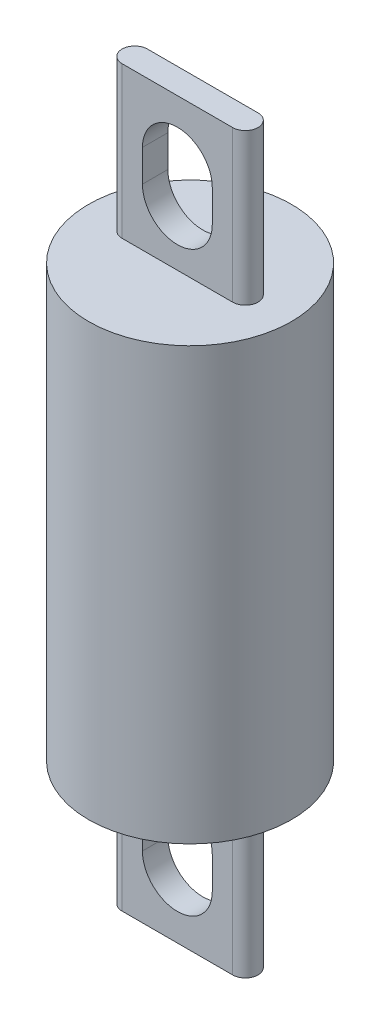
ISO-10303-21;
HEADER;
FILE_DESCRIPTION(('STEP AP214'),'2;1');
FILE_NAME('part.step','',(''),(''),'','','');
FILE_SCHEMA(('AUTOMOTIVE_DESIGN { 1 0 10303 214 1 1 1 1 }'));
ENDSEC;
DATA;
#1=APPLICATION_CONTEXT('core data for automotive mechanical design processes');
#2=APPLICATION_PROTOCOL_DEFINITION('international standard','automotive_design',2000,#1);
#3=PRODUCT_CONTEXT('',#1,'mechanical');
#4=PRODUCT('Part','Part','',(#3));
#5=PRODUCT_RELATED_PRODUCT_CATEGORY('part','',(#4));
#6=PRODUCT_DEFINITION_FORMATION('','',#4);
#7=PRODUCT_DEFINITION_CONTEXT('part definition',#1,'design');
#8=PRODUCT_DEFINITION('design','',#6,#7);
#9=PRODUCT_DEFINITION_SHAPE('','',#8);
#10=(LENGTH_UNIT() NAMED_UNIT(*) SI_UNIT(.MILLI.,.METRE.));
#11=(NAMED_UNIT(*) PLANE_ANGLE_UNIT() SI_UNIT($,.RADIAN.));
#12=(NAMED_UNIT(*) SI_UNIT($,.STERADIAN.) SOLID_ANGLE_UNIT());
#13=UNCERTAINTY_MEASURE_WITH_UNIT(LENGTH_MEASURE(1.E-05),#10,'distance_accuracy_value','');
#14=(GEOMETRIC_REPRESENTATION_CONTEXT(3) GLOBAL_UNCERTAINTY_ASSIGNED_CONTEXT((#13)) GLOBAL_UNIT_ASSIGNED_CONTEXT((#10,
#11,#12)) REPRESENTATION_CONTEXT('',''));
#15=CARTESIAN_POINT('',(0.,0.,0.));
#16=DIRECTION('',(0.,0.,1.));
#17=DIRECTION('',(1.,0.,0.));
#18=AXIS2_PLACEMENT_3D('',#15,#16,#17);
#19=CARTESIAN_POINT('',(4.3688,-38.11905,1.5875));
#20=DIRECTION('',(-1.,0.,0.));
#21=DIRECTION('',(0.,0.,1.));
#22=AXIS2_PLACEMENT_3D('',#19,#20,#21);
#23=PLANE('',#22);
#24=DIRECTION('',(0.,1.,0.));
#25=VECTOR('',#24,1.);
#26=CARTESIAN_POINT('',(4.3688,-26.9875,1.5875));
#27=LINE('',#26,#25);
#28=CARTESIAN_POINT('',(4.3688,-38.11905,1.5875));
#29=VERTEX_POINT('',#28);
#30=CARTESIAN_POINT('',(4.3688,-34.13125,1.5875));
#31=VERTEX_POINT('',#30);
#32=EDGE_CURVE('E136',#29,#31,#27,.T.);
#33=ORIENTED_EDGE('',*,*,#32,.T.);
#34=DIRECTION('',(0.,0.,1.));
#35=VECTOR('',#34,1.);
#36=CARTESIAN_POINT('',(4.3688,-34.13125,1.5875));
#37=LINE('',#36,#35);
#38=CARTESIAN_POINT('',(4.3688,-34.13125,-1.5875));
#39=VERTEX_POINT('',#38);
#40=EDGE_CURVE('E131',#31,#39,#37,.F.);
#41=ORIENTED_EDGE('',*,*,#40,.T.);
#42=DIRECTION('',(0.,1.,0.));
#43=VECTOR('',#42,1.);
#44=CARTESIAN_POINT('',(4.3688,-26.9875,-1.5875));
#45=LINE('',#44,#43);
#46=CARTESIAN_POINT('',(4.3688,-38.11905,-1.5875));
#47=VERTEX_POINT('',#46);
#48=EDGE_CURVE('E133',#39,#47,#45,.F.);
#49=ORIENTED_EDGE('',*,*,#48,.T.);
#50=DIRECTION('',(0.,0.,1.));
#51=VECTOR('',#50,1.);
#52=CARTESIAN_POINT('',(4.3688,-38.11905,1.5875));
#53=LINE('',#52,#51);
#54=EDGE_CURVE('E178',#47,#29,#53,.T.);
#55=ORIENTED_EDGE('',*,*,#54,.T.);
#56=EDGE_LOOP('',(#33,#41,#49,#55));
#57=FACE_BOUND('',#56,.T.);
#58=ADVANCED_FACE('F16',(#57),#23,.T.);
#59=CARTESIAN_POINT('',(0.,-34.13125,1.5875));
#60=DIRECTION('',(0.,0.,1.));
#61=DIRECTION('',(1.,0.,0.));
#62=AXIS2_PLACEMENT_3D('',#59,#60,#61);
#63=CYLINDRICAL_SURFACE('',#62,4.3688);
#64=ORIENTED_EDGE('',*,*,#40,.F.);
#65=CARTESIAN_POINT('',(0.,-34.13125,1.5875));
#66=DIRECTION('',(0.,0.,1.));
#67=DIRECTION('',(1.,0.,0.));
#68=AXIS2_PLACEMENT_3D('',#65,#66,#67);
#69=CIRCLE('',#68,4.3688);
#70=CARTESIAN_POINT('',(-4.3688,-34.13125,1.5875));
#71=VERTEX_POINT('',#70);
#72=EDGE_CURVE('E227',#31,#71,#69,.T.);
#73=ORIENTED_EDGE('',*,*,#72,.T.);
#74=DIRECTION('',(0.,0.,1.));
#75=VECTOR('',#74,1.);
#76=CARTESIAN_POINT('',(-4.3688,-34.13125,1.5875));
#77=LINE('',#76,#75);
#78=CARTESIAN_POINT('',(-4.3688,-34.13125,-1.5875));
#79=VERTEX_POINT('',#78);
#80=EDGE_CURVE('E126',#79,#71,#77,.T.);
#81=ORIENTED_EDGE('',*,*,#80,.F.);
#82=CARTESIAN_POINT('',(0.,-34.13125,-1.5875));
#83=DIRECTION('',(0.,0.,1.));
#84=DIRECTION('',(1.,0.,0.));
#85=AXIS2_PLACEMENT_3D('',#82,#83,#84);
#86=CIRCLE('',#85,4.3688);
#87=EDGE_CURVE('E19',#79,#39,#86,.F.);
#88=ORIENTED_EDGE('',*,*,#87,.T.);
#89=EDGE_LOOP('',(#64,#73,#81,#88));
#90=FACE_BOUND('',#89,.T.);
#91=ADVANCED_FACE('F140',(#90),#63,.F.);
#92=CARTESIAN_POINT('',(-4.3688,-34.13125,1.5875));
#93=DIRECTION('',(1.,0.,0.));
#94=DIRECTION('',(0.,1.,0.));
#95=AXIS2_PLACEMENT_3D('',#92,#93,#94);
#96=PLANE('',#95);
#97=DIRECTION('',(0.,1.,0.));
#98=VECTOR('',#97,1.);
#99=CARTESIAN_POINT('',(-4.3688,-26.9875,1.5875));
#100=LINE('',#99,#98);
#101=CARTESIAN_POINT('',(-4.3688,-38.11905,1.5875));
#102=VERTEX_POINT('',#101);
#103=EDGE_CURVE('E226',#71,#102,#100,.F.);
#104=ORIENTED_EDGE('',*,*,#103,.T.);
#105=DIRECTION('',(0.,0.,1.));
#106=VECTOR('',#105,1.);
#107=CARTESIAN_POINT('',(-4.3688,-38.11905,1.5875));
#108=LINE('',#107,#106);
#109=CARTESIAN_POINT('',(-4.3688,-38.11905,-1.5875));
#110=VERTEX_POINT('',#109);
#111=EDGE_CURVE('E167',#102,#110,#108,.F.);
#112=ORIENTED_EDGE('',*,*,#111,.T.);
#113=DIRECTION('',(0.,1.,0.));
#114=VECTOR('',#113,1.);
#115=CARTESIAN_POINT('',(-4.3688,-26.9875,-1.5875));
#116=LINE('',#115,#114);
#117=EDGE_CURVE('E143',#110,#79,#116,.T.);
#118=ORIENTED_EDGE('',*,*,#117,.T.);
#119=ORIENTED_EDGE('',*,*,#80,.T.);
#120=EDGE_LOOP('',(#104,#112,#118,#119));
#121=FACE_BOUND('',#120,.T.);
#122=ADVANCED_FACE('F357',(#121),#96,.T.);
#123=CARTESIAN_POINT('',(0.,-38.11905,1.5875));
#124=DIRECTION('',(0.,0.,1.));
#125=DIRECTION('',(1.,0.,0.));
#126=AXIS2_PLACEMENT_3D('',#123,#124,#125);
#127=CYLINDRICAL_SURFACE('',#126,4.3688);
#128=ORIENTED_EDGE('',*,*,#111,.F.);
#129=CARTESIAN_POINT('',(0.,-38.11905,1.5875));
#130=DIRECTION('',(0.,0.,1.));
#131=DIRECTION('',(1.,0.,0.));
#132=AXIS2_PLACEMENT_3D('',#129,#130,#131);
#133=CIRCLE('',#132,4.3688);
#134=EDGE_CURVE('E223',#102,#29,#133,.T.);
#135=ORIENTED_EDGE('',*,*,#134,.T.);
#136=ORIENTED_EDGE('',*,*,#54,.F.);
#137=CARTESIAN_POINT('',(0.,-38.11905,-1.5875));
#138=DIRECTION('',(0.,0.,1.));
#139=DIRECTION('',(1.,0.,0.));
#140=AXIS2_PLACEMENT_3D('',#137,#138,#139);
#141=CIRCLE('',#140,4.3688);
#142=EDGE_CURVE('E147',#47,#110,#141,.F.);
#143=ORIENTED_EDGE('',*,*,#142,.T.);
#144=EDGE_LOOP('',(#128,#135,#136,#143));
#145=FACE_BOUND('',#144,.T.);
#146=ADVANCED_FACE('F354',(#145),#127,.F.);
#147=CARTESIAN_POINT('',(0.,-45.9105,0.));
#148=DIRECTION('',(0.,1.,0.));
#149=DIRECTION('',(0.,0.,1.));
#150=AXIS2_PLACEMENT_3D('',#147,#148,#149);
#151=PLANE('',#150);
#152=CARTESIAN_POINT('',(-6.9215,-45.9105,0.));
#153=DIRECTION('',(0.,1.,0.));
#154=DIRECTION('',(0.,0.,1.));
#155=AXIS2_PLACEMENT_3D('',#152,#153,#154);
#156=CIRCLE('',#155,1.5875);
#157=CARTESIAN_POINT('',(-6.9215,-45.9105,-1.5875));
#158=VERTEX_POINT('',#157);
#159=CARTESIAN_POINT('',(-6.9215,-45.9105,1.5875));
#160=VERTEX_POINT('',#159);
#161=EDGE_CURVE('E220',#158,#160,#156,.T.);
#162=ORIENTED_EDGE('',*,*,#161,.F.);
#163=DIRECTION('',(1.,0.,0.));
#164=VECTOR('',#163,1.);
#165=CARTESIAN_POINT('',(6.9215,-45.9105,-1.5875));
#166=LINE('',#165,#164);
#167=CARTESIAN_POINT('',(6.9215,-45.9105,-1.5875));
#168=VERTEX_POINT('',#167);
#169=EDGE_CURVE('E149',#158,#168,#166,.T.);
#170=ORIENTED_EDGE('',*,*,#169,.T.);
#171=CARTESIAN_POINT('',(6.9215,-45.9105,0.));
#172=DIRECTION('',(0.,1.,0.));
#173=DIRECTION('',(0.,0.,1.));
#174=AXIS2_PLACEMENT_3D('',#171,#172,#173);
#175=CIRCLE('',#174,1.5875);
#176=CARTESIAN_POINT('',(6.9215,-45.9105,1.5875));
#177=VERTEX_POINT('',#176);
#178=EDGE_CURVE('E177',#177,#168,#175,.T.);
#179=ORIENTED_EDGE('',*,*,#178,.F.);
#180=DIRECTION('',(-1.,0.,0.));
#181=VECTOR('',#180,1.);
#182=CARTESIAN_POINT('',(-6.9215,-45.9105,1.5875));
#183=LINE('',#182,#181);
#184=EDGE_CURVE('E172',#177,#160,#183,.T.);
#185=ORIENTED_EDGE('',*,*,#184,.T.);
#186=EDGE_LOOP('',(#162,#170,#179,#185));
#187=FACE_BOUND('',#186,.T.);
#188=ADVANCED_FACE('F249',(#187),#151,.F.);
#189=CARTESIAN_POINT('',(0.,34.13125,1.5875));
#190=DIRECTION('',(0.,0.,-1.));
#191=DIRECTION('',(-1.,0.,0.));
#192=AXIS2_PLACEMENT_3D('',#189,#190,#191);
#193=CYLINDRICAL_SURFACE('',#192,4.3688);
#194=DIRECTION('',(0.,0.,1.));
#195=VECTOR('',#194,1.);
#196=CARTESIAN_POINT('',(-4.3688,34.13125,1.5875));
#197=LINE('',#196,#195);
#198=CARTESIAN_POINT('',(-4.3688,34.13125,-1.5875));
#199=VERTEX_POINT('',#198);
#200=CARTESIAN_POINT('',(-4.3688,34.13125,1.5875));
#201=VERTEX_POINT('',#200);
#202=EDGE_CURVE('E165',#199,#201,#197,.T.);
#203=ORIENTED_EDGE('',*,*,#202,.T.);
#204=CARTESIAN_POINT('',(0.,34.13125,1.5875));
#205=DIRECTION('',(0.,0.,-1.));
#206=DIRECTION('',(-1.,0.,0.));
#207=AXIS2_PLACEMENT_3D('',#204,#205,#206);
#208=CIRCLE('',#207,4.3688);
#209=CARTESIAN_POINT('',(4.3688,34.13125,1.5875));
#210=VERTEX_POINT('',#209);
#211=EDGE_CURVE('E204',#210,#201,#208,.T.);
#212=ORIENTED_EDGE('',*,*,#211,.F.);
#213=DIRECTION('',(0.,0.,-1.));
#214=VECTOR('',#213,1.);
#215=CARTESIAN_POINT('',(4.3688,34.13125,1.5875));
#216=LINE('',#215,#214);
#217=CARTESIAN_POINT('',(4.3688,34.13125,-1.5875));
#218=VERTEX_POINT('',#217);
#219=EDGE_CURVE('E155',#210,#218,#216,.T.);
#220=ORIENTED_EDGE('',*,*,#219,.T.);
#221=CARTESIAN_POINT('',(0.,34.13125,-1.5875));
#222=DIRECTION('',(0.,0.,-1.));
#223=DIRECTION('',(-1.,0.,0.));
#224=AXIS2_PLACEMENT_3D('',#221,#222,#223);
#225=CIRCLE('',#224,4.3688);
#226=EDGE_CURVE('E214',#199,#218,#225,.F.);
#227=ORIENTED_EDGE('',*,*,#226,.F.);
#228=EDGE_LOOP('',(#203,#212,#220,#227));
#229=FACE_BOUND('',#228,.T.);
#230=ADVANCED_FACE('F347',(#229),#193,.F.);
#231=CARTESIAN_POINT('',(-4.3688,34.13125,1.5875));
#232=DIRECTION('',(-1.,0.,0.));
#233=DIRECTION('',(0.,-1.,0.));
#234=AXIS2_PLACEMENT_3D('',#231,#232,#233);
#235=PLANE('',#234);
#236=DIRECTION('',(0.,0.,-1.));
#237=VECTOR('',#236,1.);
#238=CARTESIAN_POINT('',(-4.3688,38.11905,1.5875));
#239=LINE('',#238,#237);
#240=CARTESIAN_POINT('',(-4.3688,38.11905,-1.5875));
#241=VERTEX_POINT('',#240);
#242=CARTESIAN_POINT('',(-4.3688,38.11905,1.5875));
#243=VERTEX_POINT('',#242);
#244=EDGE_CURVE('E162',#241,#243,#239,.F.);
#245=ORIENTED_EDGE('',*,*,#244,.T.);
#246=DIRECTION('',(0.,1.,0.));
#247=VECTOR('',#246,1.);
#248=CARTESIAN_POINT('',(-4.3688,26.9875,1.5875));
#249=LINE('',#248,#247);
#250=EDGE_CURVE('E203',#201,#243,#249,.T.);
#251=ORIENTED_EDGE('',*,*,#250,.F.);
#252=ORIENTED_EDGE('',*,*,#202,.F.);
#253=DIRECTION('',(0.,1.,0.));
#254=VECTOR('',#253,1.);
#255=CARTESIAN_POINT('',(-4.3688,26.9875,-1.5875));
#256=LINE('',#255,#254);
#257=EDGE_CURVE('E212',#241,#199,#256,.F.);
#258=ORIENTED_EDGE('',*,*,#257,.F.);
#259=EDGE_LOOP('',(#245,#251,#252,#258));
#260=FACE_BOUND('',#259,.T.);
#261=ADVANCED_FACE('F343',(#260),#235,.F.);
#262=CARTESIAN_POINT('',(0.,38.11905,1.5875));
#263=DIRECTION('',(0.,0.,-1.));
#264=DIRECTION('',(-1.,0.,0.));
#265=AXIS2_PLACEMENT_3D('',#262,#263,#264);
#266=CYLINDRICAL_SURFACE('',#265,4.3688);
#267=DIRECTION('',(0.,0.,-1.));
#268=VECTOR('',#267,1.);
#269=CARTESIAN_POINT('',(4.3688,38.11905,1.5875));
#270=LINE('',#269,#268);
#271=CARTESIAN_POINT('',(4.3688,38.11905,-1.5875));
#272=VERTEX_POINT('',#271);
#273=CARTESIAN_POINT('',(4.3688,38.11905,1.5875));
#274=VERTEX_POINT('',#273);
#275=EDGE_CURVE('E160',#272,#274,#270,.F.);
#276=ORIENTED_EDGE('',*,*,#275,.T.);
#277=CARTESIAN_POINT('',(0.,38.11905,1.5875));
#278=DIRECTION('',(0.,0.,-1.));
#279=DIRECTION('',(-1.,0.,0.));
#280=AXIS2_PLACEMENT_3D('',#277,#278,#279);
#281=CIRCLE('',#280,4.3688);
#282=EDGE_CURVE('E199',#243,#274,#281,.T.);
#283=ORIENTED_EDGE('',*,*,#282,.F.);
#284=ORIENTED_EDGE('',*,*,#244,.F.);
#285=CARTESIAN_POINT('',(0.,38.11905,-1.5875));
#286=DIRECTION('',(0.,0.,-1.));
#287=DIRECTION('',(-1.,0.,0.));
#288=AXIS2_PLACEMENT_3D('',#285,#286,#287);
#289=CIRCLE('',#288,4.3688);
#290=EDGE_CURVE('E209',#272,#241,#289,.F.);
#291=ORIENTED_EDGE('',*,*,#290,.F.);
#292=EDGE_LOOP('',(#276,#283,#284,#291));
#293=FACE_BOUND('',#292,.T.);
#294=ADVANCED_FACE('F339',(#293),#266,.F.);
#295=CARTESIAN_POINT('',(4.3688,38.11905,1.5875));
#296=DIRECTION('',(1.,0.,0.));
#297=DIRECTION('',(0.,0.,-1.));
#298=AXIS2_PLACEMENT_3D('',#295,#296,#297);
#299=PLANE('',#298);
#300=ORIENTED_EDGE('',*,*,#219,.F.);
#301=DIRECTION('',(0.,1.,0.));
#302=VECTOR('',#301,1.);
#303=CARTESIAN_POINT('',(4.3688,26.9875,1.5875));
#304=LINE('',#303,#302);
#305=EDGE_CURVE('E202',#274,#210,#304,.F.);
#306=ORIENTED_EDGE('',*,*,#305,.F.);
#307=ORIENTED_EDGE('',*,*,#275,.F.);
#308=DIRECTION('',(0.,1.,0.));
#309=VECTOR('',#308,1.);
#310=CARTESIAN_POINT('',(4.3688,26.9875,-1.5875));
#311=LINE('',#310,#309);
#312=EDGE_CURVE('E213',#218,#272,#311,.T.);
#313=ORIENTED_EDGE('',*,*,#312,.F.);
#314=EDGE_LOOP('',(#300,#306,#307,#313));
#315=FACE_BOUND('',#314,.T.);
#316=ADVANCED_FACE('F336',(#315),#299,.F.);
#317=CARTESIAN_POINT('',(0.,45.9105,0.));
#318=DIRECTION('',(0.,1.,0.));
#319=DIRECTION('',(0.,0.,1.));
#320=AXIS2_PLACEMENT_3D('',#317,#318,#319);
#321=PLANE('',#320);
#322=DIRECTION('',(-1.,0.,0.));
#323=VECTOR('',#322,1.);
#324=CARTESIAN_POINT('',(6.9215,45.9105,-1.5875));
#325=LINE('',#324,#323);
#326=CARTESIAN_POINT('',(-6.9215,45.9105,-1.5875));
#327=VERTEX_POINT('',#326);
#328=CARTESIAN_POINT('',(6.9215,45.9105,-1.5875));
#329=VERTEX_POINT('',#328);
#330=EDGE_CURVE('E168',#327,#329,#325,.F.);
#331=ORIENTED_EDGE('',*,*,#330,.F.);
#332=CARTESIAN_POINT('',(-6.9215,45.9105,0.));
#333=DIRECTION('',(0.,1.,0.));
#334=DIRECTION('',(0.,0.,1.));
#335=AXIS2_PLACEMENT_3D('',#332,#333,#334);
#336=CIRCLE('',#335,1.5875);
#337=CARTESIAN_POINT('',(-6.9215,45.9105,1.5875));
#338=VERTEX_POINT('',#337);
#339=EDGE_CURVE('E217',#338,#327,#336,.F.);
#340=ORIENTED_EDGE('',*,*,#339,.F.);
#341=DIRECTION('',(1.,0.,0.));
#342=VECTOR('',#341,1.);
#343=CARTESIAN_POINT('',(-6.9215,45.9105,1.5875));
#344=LINE('',#343,#342);
#345=CARTESIAN_POINT('',(6.9215,45.9105,1.5875));
#346=VERTEX_POINT('',#345);
#347=EDGE_CURVE('E156',#346,#338,#344,.F.);
#348=ORIENTED_EDGE('',*,*,#347,.F.);
#349=CARTESIAN_POINT('',(6.9215,45.9105,0.));
#350=DIRECTION('',(0.,1.,0.));
#351=DIRECTION('',(0.,0.,1.));
#352=AXIS2_PLACEMENT_3D('',#349,#350,#351);
#353=CIRCLE('',#352,1.5875);
#354=EDGE_CURVE('E207',#329,#346,#353,.F.);
#355=ORIENTED_EDGE('',*,*,#354,.F.);
#356=EDGE_LOOP('',(#331,#340,#348,#355));
#357=FACE_BOUND('',#356,.T.);
#358=ADVANCED_FACE('F312',(#357),#321,.T.);
#359=CARTESIAN_POINT('',(6.9215,-26.9875,-1.5875));
#360=DIRECTION('',(0.,0.,1.));
#361=DIRECTION('',(1.,0.,0.));
#362=AXIS2_PLACEMENT_3D('',#359,#360,#361);
#363=PLANE('',#362);
#364=DIRECTION('',(0.,1.,0.));
#365=VECTOR('',#364,1.);
#366=CARTESIAN_POINT('',(6.9215,-26.9875,-1.5875));
#367=LINE('',#366,#365);
#368=CARTESIAN_POINT('',(6.9215,-26.9875,-1.5875));
#369=VERTEX_POINT('',#368);
#370=EDGE_CURVE('E152',#168,#369,#367,.T.);
#371=ORIENTED_EDGE('',*,*,#370,.F.);
#372=ORIENTED_EDGE('',*,*,#169,.F.);
#373=DIRECTION('',(0.,1.,0.));
#374=VECTOR('',#373,1.);
#375=CARTESIAN_POINT('',(-6.9215,-26.9875,-1.5875));
#376=LINE('',#375,#374);
#377=CARTESIAN_POINT('',(-6.9215,-26.9875,-1.5875));
#378=VERTEX_POINT('',#377);
#379=EDGE_CURVE('E174',#378,#158,#376,.F.);
#380=ORIENTED_EDGE('',*,*,#379,.F.);
#381=DIRECTION('',(1.,0.,0.));
#382=VECTOR('',#381,1.);
#383=CARTESIAN_POINT('',(0.,-26.9875,-1.5875));
#384=LINE('',#383,#382);
#385=EDGE_CURVE('E198',#378,#369,#384,.T.);
#386=ORIENTED_EDGE('',*,*,#385,.T.);
#387=EDGE_LOOP('',(#371,#372,#380,#386));
#388=FACE_BOUND('',#387,.T.);
#389=ORIENTED_EDGE('',*,*,#48,.F.);
#390=ORIENTED_EDGE('',*,*,#87,.F.);
#391=ORIENTED_EDGE('',*,*,#117,.F.);
#392=ORIENTED_EDGE('',*,*,#142,.F.);
#393=EDGE_LOOP('',(#389,#390,#391,#392));
#394=FACE_BOUND('',#393,.T.);
#395=ADVANCED_FACE('F145',(#388,#394),#363,.F.);
#396=CARTESIAN_POINT('',(6.9215,-26.9875,0.));
#397=DIRECTION('',(0.,1.,0.));
#398=DIRECTION('',(0.,0.,1.));
#399=AXIS2_PLACEMENT_3D('',#396,#397,#398);
#400=CYLINDRICAL_SURFACE('',#399,1.5875);
#401=ORIENTED_EDGE('',*,*,#178,.T.);
#402=ORIENTED_EDGE('',*,*,#370,.T.);
#403=CARTESIAN_POINT('',(6.9215,-26.9875,0.));
#404=DIRECTION('',(0.,1.,0.));
#405=DIRECTION('',(0.,0.,1.));
#406=AXIS2_PLACEMENT_3D('',#403,#404,#405);
#407=CIRCLE('',#406,1.5875);
#408=CARTESIAN_POINT('',(6.9215,-26.9875,1.5875));
#409=VERTEX_POINT('',#408);
#410=EDGE_CURVE('E196',#369,#409,#407,.F.);
#411=ORIENTED_EDGE('',*,*,#410,.T.);
#412=DIRECTION('',(0.,1.,0.));
#413=VECTOR('',#412,1.);
#414=CARTESIAN_POINT('',(6.9215,-26.9875,1.5875));
#415=LINE('',#414,#413);
#416=EDGE_CURVE('E175',#409,#177,#415,.F.);
#417=ORIENTED_EDGE('',*,*,#416,.T.);
#418=EDGE_LOOP('',(#401,#402,#411,#417));
#419=FACE_BOUND('',#418,.T.);
#420=ADVANCED_FACE('F240',(#419),#400,.T.);
#421=CARTESIAN_POINT('',(-6.9215,-26.9875,1.5875));
#422=DIRECTION('',(0.,0.,-1.));
#423=DIRECTION('',(-1.,0.,0.));
#424=AXIS2_PLACEMENT_3D('',#421,#422,#423);
#425=PLANE('',#424);
#426=DIRECTION('',(0.,1.,0.));
#427=VECTOR('',#426,1.);
#428=CARTESIAN_POINT('',(-6.9215,-26.9875,1.5875));
#429=LINE('',#428,#427);
#430=CARTESIAN_POINT('',(-6.9215,-26.9875,1.5875));
#431=VERTEX_POINT('',#430);
#432=EDGE_CURVE('E219',#160,#431,#429,.T.);
#433=ORIENTED_EDGE('',*,*,#432,.F.);
#434=ORIENTED_EDGE('',*,*,#184,.F.);
#435=ORIENTED_EDGE('',*,*,#416,.F.);
#436=DIRECTION('',(1.,0.,0.));
#437=VECTOR('',#436,1.);
#438=CARTESIAN_POINT('',(0.,-26.9875,1.5875));
#439=LINE('',#438,#437);
#440=EDGE_CURVE('E195',#409,#431,#439,.F.);
#441=ORIENTED_EDGE('',*,*,#440,.T.);
#442=EDGE_LOOP('',(#433,#434,#435,#441));
#443=FACE_BOUND('',#442,.T.);
#444=ORIENTED_EDGE('',*,*,#103,.F.);
#445=ORIENTED_EDGE('',*,*,#72,.F.);
#446=ORIENTED_EDGE('',*,*,#32,.F.);
#447=ORIENTED_EDGE('',*,*,#134,.F.);
#448=EDGE_LOOP('',(#444,#445,#446,#447));
#449=FACE_BOUND('',#448,.T.);
#450=ADVANCED_FACE('F244',(#443,#449),#425,.F.);
#451=CARTESIAN_POINT('',(-6.9215,-26.9875,0.));
#452=DIRECTION('',(0.,1.,0.));
#453=DIRECTION('',(0.,0.,1.));
#454=AXIS2_PLACEMENT_3D('',#451,#452,#453);
#455=CYLINDRICAL_SURFACE('',#454,1.5875);
#456=ORIENTED_EDGE('',*,*,#161,.T.);
#457=ORIENTED_EDGE('',*,*,#432,.T.);
#458=CARTESIAN_POINT('',(-6.9215,-26.9875,0.));
#459=DIRECTION('',(0.,1.,0.));
#460=DIRECTION('',(0.,0.,1.));
#461=AXIS2_PLACEMENT_3D('',#458,#459,#460);
#462=CIRCLE('',#461,1.5875);
#463=EDGE_CURVE('E192',#431,#378,#462,.F.);
#464=ORIENTED_EDGE('',*,*,#463,.T.);
#465=ORIENTED_EDGE('',*,*,#379,.T.);
#466=EDGE_LOOP('',(#456,#457,#464,#465));
#467=FACE_BOUND('',#466,.T.);
#468=ADVANCED_FACE('F275',(#467),#455,.T.);
#469=CARTESIAN_POINT('',(-6.9215,26.9875,0.));
#470=DIRECTION('',(0.,1.,0.));
#471=DIRECTION('',(0.,0.,1.));
#472=AXIS2_PLACEMENT_3D('',#469,#470,#471);
#473=CYLINDRICAL_SURFACE('',#472,1.5875);
#474=ORIENTED_EDGE('',*,*,#339,.T.);
#475=DIRECTION('',(0.,1.,0.));
#476=VECTOR('',#475,1.);
#477=CARTESIAN_POINT('',(-6.9215,26.9875,-1.5875));
#478=LINE('',#477,#476);
#479=CARTESIAN_POINT('',(-6.9215,26.9875,-1.5875));
#480=VERTEX_POINT('',#479);
#481=EDGE_CURVE('E171',#480,#327,#478,.T.);
#482=ORIENTED_EDGE('',*,*,#481,.F.);
#483=CARTESIAN_POINT('',(-6.9215,26.9875,0.));
#484=DIRECTION('',(0.,1.,0.));
#485=DIRECTION('',(0.,0.,1.));
#486=AXIS2_PLACEMENT_3D('',#483,#484,#485);
#487=CIRCLE('',#486,1.5875);
#488=CARTESIAN_POINT('',(-6.9215,26.9875,1.5875));
#489=VERTEX_POINT('',#488);
#490=EDGE_CURVE('E189',#489,#480,#487,.F.);
#491=ORIENTED_EDGE('',*,*,#490,.F.);
#492=DIRECTION('',(0.,1.,0.));
#493=VECTOR('',#492,1.);
#494=CARTESIAN_POINT('',(-6.9215,26.9875,1.5875));
#495=LINE('',#494,#493);
#496=EDGE_CURVE('E159',#338,#489,#495,.F.);
#497=ORIENTED_EDGE('',*,*,#496,.F.);
#498=EDGE_LOOP('',(#474,#482,#491,#497));
#499=FACE_BOUND('',#498,.T.);
#500=ADVANCED_FACE('F317',(#499),#473,.T.);
#501=CARTESIAN_POINT('',(6.9215,26.9875,-1.5875));
#502=DIRECTION('',(0.,0.,-1.));
#503=DIRECTION('',(-1.,0.,0.));
#504=AXIS2_PLACEMENT_3D('',#501,#502,#503);
#505=PLANE('',#504);
#506=ORIENTED_EDGE('',*,*,#330,.T.);
#507=DIRECTION('',(0.,1.,0.));
#508=VECTOR('',#507,1.);
#509=CARTESIAN_POINT('',(6.9215,26.9875,-1.5875));
#510=LINE('',#509,#508);
#511=CARTESIAN_POINT('',(6.9215,26.9875,-1.5875));
#512=VERTEX_POINT('',#511);
#513=EDGE_CURVE('E170',#512,#329,#510,.T.);
#514=ORIENTED_EDGE('',*,*,#513,.F.);
#515=DIRECTION('',(1.,0.,0.));
#516=VECTOR('',#515,1.);
#517=CARTESIAN_POINT('',(0.,26.9875,-1.5875));
#518=LINE('',#517,#516);
#519=EDGE_CURVE('E188',#480,#512,#518,.T.);
#520=ORIENTED_EDGE('',*,*,#519,.F.);
#521=ORIENTED_EDGE('',*,*,#481,.T.);
#522=EDGE_LOOP('',(#506,#514,#520,#521));
#523=FACE_BOUND('',#522,.T.);
#524=ORIENTED_EDGE('',*,*,#290,.T.);
#525=ORIENTED_EDGE('',*,*,#257,.T.);
#526=ORIENTED_EDGE('',*,*,#226,.T.);
#527=ORIENTED_EDGE('',*,*,#312,.T.);
#528=EDGE_LOOP('',(#524,#525,#526,#527));
#529=FACE_BOUND('',#528,.T.);
#530=ADVANCED_FACE('F308',(#523,#529),#505,.T.);
#531=CARTESIAN_POINT('',(6.9215,26.9875,0.));
#532=DIRECTION('',(0.,1.,0.));
#533=DIRECTION('',(0.,0.,1.));
#534=AXIS2_PLACEMENT_3D('',#531,#532,#533);
#535=CYLINDRICAL_SURFACE('',#534,1.5875);
#536=ORIENTED_EDGE('',*,*,#354,.T.);
#537=DIRECTION('',(0.,1.,0.));
#538=VECTOR('',#537,1.);
#539=CARTESIAN_POINT('',(6.9215,26.9875,1.5875));
#540=LINE('',#539,#538);
#541=CARTESIAN_POINT('',(6.9215,26.9875,1.5875));
#542=VERTEX_POINT('',#541);
#543=EDGE_CURVE('E34',#542,#346,#540,.T.);
#544=ORIENTED_EDGE('',*,*,#543,.F.);
#545=CARTESIAN_POINT('',(6.9215,26.9875,0.));
#546=DIRECTION('',(0.,1.,0.));
#547=DIRECTION('',(0.,0.,1.));
#548=AXIS2_PLACEMENT_3D('',#545,#546,#547);
#549=CIRCLE('',#548,1.5875);
#550=EDGE_CURVE('E185',#512,#542,#549,.F.);
#551=ORIENTED_EDGE('',*,*,#550,.F.);
#552=ORIENTED_EDGE('',*,*,#513,.T.);
#553=EDGE_LOOP('',(#536,#544,#551,#552));
#554=FACE_BOUND('',#553,.T.);
#555=ADVANCED_FACE('F290',(#554),#535,.T.);
#556=CARTESIAN_POINT('',(-6.9215,26.9875,1.5875));
#557=DIRECTION('',(0.,0.,1.));
#558=DIRECTION('',(1.,0.,0.));
#559=AXIS2_PLACEMENT_3D('',#556,#557,#558);
#560=PLANE('',#559);
#561=ORIENTED_EDGE('',*,*,#347,.T.);
#562=ORIENTED_EDGE('',*,*,#496,.T.);
#563=DIRECTION('',(1.,0.,0.));
#564=VECTOR('',#563,1.);
#565=CARTESIAN_POINT('',(0.,26.9875,1.5875));
#566=LINE('',#565,#564);
#567=EDGE_CURVE('E184',#542,#489,#566,.F.);
#568=ORIENTED_EDGE('',*,*,#567,.F.);
#569=ORIENTED_EDGE('',*,*,#543,.T.);
#570=EDGE_LOOP('',(#561,#562,#568,#569));
#571=FACE_BOUND('',#570,.T.);
#572=ORIENTED_EDGE('',*,*,#282,.T.);
#573=ORIENTED_EDGE('',*,*,#305,.T.);
#574=ORIENTED_EDGE('',*,*,#211,.T.);
#575=ORIENTED_EDGE('',*,*,#250,.T.);
#576=EDGE_LOOP('',(#572,#573,#574,#575));
#577=FACE_BOUND('',#576,.T.);
#578=ADVANCED_FACE('F279',(#571,#577),#560,.T.);
#579=CARTESIAN_POINT('',(0.,-26.9875,0.));
#580=DIRECTION('',(0.,1.,0.));
#581=DIRECTION('',(0.,0.,1.));
#582=AXIS2_PLACEMENT_3D('',#579,#580,#581);
#583=PLANE('',#582);
#584=CARTESIAN_POINT('',(0.,-26.9875,0.));
#585=DIRECTION('',(0.,1.,0.));
#586=DIRECTION('',(0.,0.,1.));
#587=AXIS2_PLACEMENT_3D('',#584,#585,#586);
#588=CIRCLE('',#587,12.7);
#589=CARTESIAN_POINT('',(0.,-26.9875,12.7));
#590=VERTEX_POINT('',#589);
#591=EDGE_CURVE('E25',#590,#590,#588,.T.);
#592=ORIENTED_EDGE('',*,*,#591,.F.);
#593=EDGE_LOOP('',(#592));
#594=FACE_BOUND('',#593,.T.);
#595=ORIENTED_EDGE('',*,*,#440,.F.);
#596=ORIENTED_EDGE('',*,*,#410,.F.);
#597=ORIENTED_EDGE('',*,*,#385,.F.);
#598=ORIENTED_EDGE('',*,*,#463,.F.);
#599=EDGE_LOOP('',(#595,#596,#597,#598));
#600=FACE_BOUND('',#599,.T.);
#601=ADVANCED_FACE('F276',(#594,#600),#583,.F.);
#602=CARTESIAN_POINT('',(0.,26.9875,0.));
#603=DIRECTION('',(0.,1.,0.));
#604=DIRECTION('',(0.,0.,1.));
#605=AXIS2_PLACEMENT_3D('',#602,#603,#604);
#606=PLANE('',#605);
#607=CARTESIAN_POINT('',(0.,26.9875,0.));
#608=DIRECTION('',(0.,1.,0.));
#609=DIRECTION('',(0.,0.,1.));
#610=AXIS2_PLACEMENT_3D('',#607,#608,#609);
#611=CIRCLE('',#610,12.7);
#612=CARTESIAN_POINT('',(0.,26.9875,12.7));
#613=VERTEX_POINT('',#612);
#614=EDGE_CURVE('E9',#613,#613,#611,.F.);
#615=ORIENTED_EDGE('',*,*,#614,.F.);
#616=EDGE_LOOP('',(#615));
#617=FACE_BOUND('',#616,.T.);
#618=ORIENTED_EDGE('',*,*,#550,.T.);
#619=ORIENTED_EDGE('',*,*,#567,.T.);
#620=ORIENTED_EDGE('',*,*,#490,.T.);
#621=ORIENTED_EDGE('',*,*,#519,.T.);
#622=EDGE_LOOP('',(#618,#619,#620,#621));
#623=FACE_BOUND('',#622,.T.);
#624=ADVANCED_FACE('F278',(#617,#623),#606,.T.);
#625=CARTESIAN_POINT('',(0.,0.,0.));
#626=DIRECTION('',(0.,1.,0.));
#627=DIRECTION('',(0.,0.,1.));
#628=AXIS2_PLACEMENT_3D('',#625,#626,#627);
#629=CYLINDRICAL_SURFACE('',#628,12.7);
#630=ORIENTED_EDGE('',*,*,#614,.T.);
#631=EDGE_LOOP('',(#630));
#632=FACE_BOUND('',#631,.T.);
#633=ORIENTED_EDGE('',*,*,#591,.T.);
#634=EDGE_LOOP('',(#633));
#635=FACE_BOUND('',#634,.T.);
#636=ADVANCED_FACE('F287',(#632,#635),#629,.T.);
#637=CLOSED_SHELL('',(#58,#91,#122,#146,#188,#230,#261,#294,#316,#358,#395,#420,#450,#468,#500,
#530,#555,#578,#601,#624,#636));
#638=MANIFOLD_SOLID_BREP('B1',#637);
#639=ADVANCED_BREP_SHAPE_REPRESENTATION('',(#18,#638),#14);
#640=SHAPE_DEFINITION_REPRESENTATION(#9,#639);
ENDSEC;
END-ISO-10303-21;
